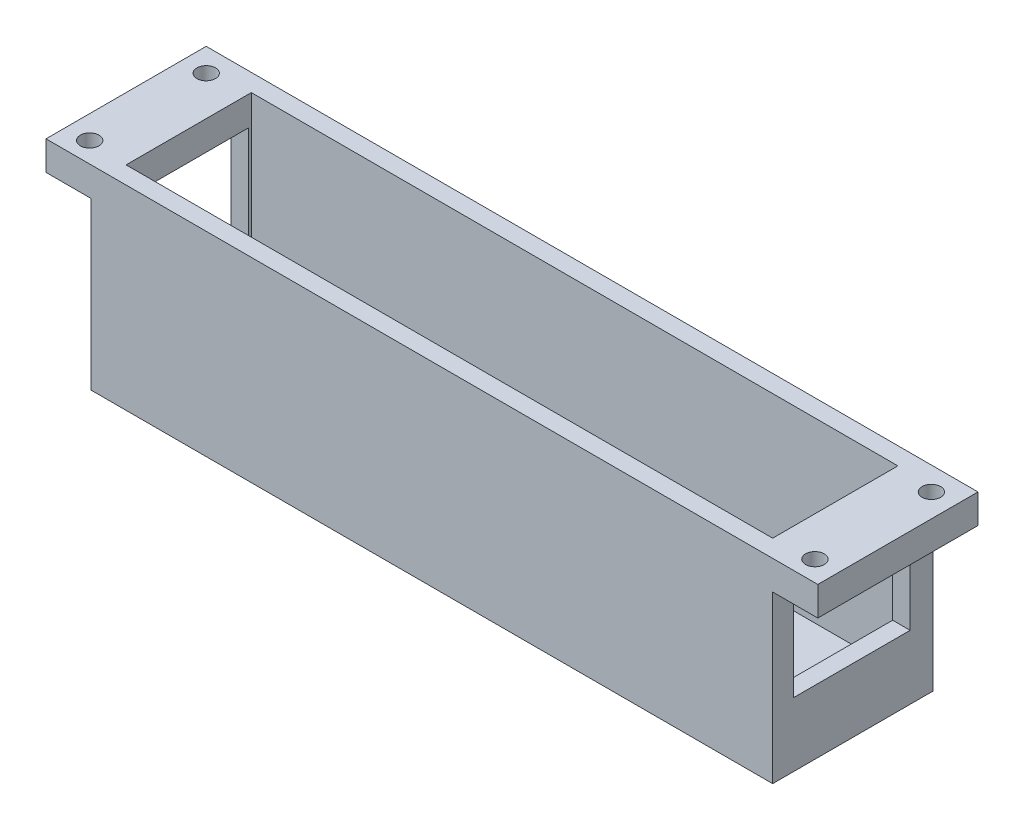
ISO-10303-21;
HEADER;
FILE_DESCRIPTION(('STEP AP214'),'2;1');
FILE_NAME('part.step','',(''),(''),'','','');
FILE_SCHEMA(('AUTOMOTIVE_DESIGN { 1 0 10303 214 1 1 1 1 }'));
ENDSEC;
DATA;
#1=APPLICATION_CONTEXT('core data for automotive mechanical design processes');
#2=APPLICATION_PROTOCOL_DEFINITION('international standard','automotive_design',2000,#1);
#3=PRODUCT_CONTEXT('',#1,'mechanical');
#4=PRODUCT('Part','Part','',(#3));
#5=PRODUCT_RELATED_PRODUCT_CATEGORY('part','',(#4));
#6=PRODUCT_DEFINITION_FORMATION('','',#4);
#7=PRODUCT_DEFINITION_CONTEXT('part definition',#1,'design');
#8=PRODUCT_DEFINITION('design','',#6,#7);
#9=PRODUCT_DEFINITION_SHAPE('','',#8);
#10=(LENGTH_UNIT() NAMED_UNIT(*) SI_UNIT(.MILLI.,.METRE.));
#11=(NAMED_UNIT(*) PLANE_ANGLE_UNIT() SI_UNIT($,.RADIAN.));
#12=(NAMED_UNIT(*) SI_UNIT($,.STERADIAN.) SOLID_ANGLE_UNIT());
#13=UNCERTAINTY_MEASURE_WITH_UNIT(LENGTH_MEASURE(1.E-05),#10,'distance_accuracy_value','');
#14=(GEOMETRIC_REPRESENTATION_CONTEXT(3) GLOBAL_UNCERTAINTY_ASSIGNED_CONTEXT((#13)) GLOBAL_UNIT_ASSIGNED_CONTEXT((#10,
#11,#12)) REPRESENTATION_CONTEXT('',''));
#15=CARTESIAN_POINT('',(0.,0.,0.));
#16=DIRECTION('',(0.,0.,1.));
#17=DIRECTION('',(1.,0.,0.));
#18=AXIS2_PLACEMENT_3D('',#15,#16,#17);
#19=CARTESIAN_POINT('',(0.,0.,27.5));
#20=DIRECTION('',(1.,0.,0.));
#21=DIRECTION('',(0.,0.,-1.));
#22=AXIS2_PLACEMENT_3D('',#19,#20,#21);
#23=PLANE('',#22);
#24=DIRECTION('',(0.,0.,1.));
#25=VECTOR('',#24,1.);
#26=CARTESIAN_POINT('',(0.,8.5,3.5));
#27=LINE('',#26,#25);
#28=CARTESIAN_POINT('',(0.,8.5,3.5));
#29=VERTEX_POINT('',#28);
#30=CARTESIAN_POINT('',(0.,8.5,24.));
#31=VERTEX_POINT('',#30);
#32=EDGE_CURVE('E206',#29,#31,#27,.T.);
#33=ORIENTED_EDGE('',*,*,#32,.F.);
#34=DIRECTION('',(0.,-1.,0.));
#35=VECTOR('',#34,1.);
#36=CARTESIAN_POINT('',(0.,28.5,3.5));
#37=LINE('',#36,#35);
#38=CARTESIAN_POINT('',(0.,28.5,3.5));
#39=VERTEX_POINT('',#38);
#40=EDGE_CURVE('E186',#39,#29,#37,.T.);
#41=ORIENTED_EDGE('',*,*,#40,.F.);
#42=DIRECTION('',(0.,0.,-1.));
#43=VECTOR('',#42,1.);
#44=CARTESIAN_POINT('',(0.,28.5,27.5));
#45=LINE('',#44,#43);
#46=CARTESIAN_POINT('',(0.,28.5,0.));
#47=VERTEX_POINT('',#46);
#48=EDGE_CURVE('E339',#39,#47,#45,.T.);
#49=ORIENTED_EDGE('',*,*,#48,.T.);
#50=DIRECTION('',(0.,-1.,0.));
#51=VECTOR('',#50,1.);
#52=CARTESIAN_POINT('',(0.,0.,0.));
#53=LINE('',#52,#51);
#54=CARTESIAN_POINT('',(0.,0.,0.));
#55=VERTEX_POINT('',#54);
#56=EDGE_CURVE('E312',#47,#55,#53,.T.);
#57=ORIENTED_EDGE('',*,*,#56,.T.);
#58=DIRECTION('',(0.,0.,-1.));
#59=VECTOR('',#58,1.);
#60=CARTESIAN_POINT('',(0.,0.,27.5));
#61=LINE('',#60,#59);
#62=CARTESIAN_POINT('',(0.,0.,27.5));
#63=VERTEX_POINT('',#62);
#64=EDGE_CURVE('E12',#63,#55,#61,.T.);
#65=ORIENTED_EDGE('',*,*,#64,.F.);
#66=DIRECTION('',(0.,-1.,0.));
#67=VECTOR('',#66,1.);
#68=CARTESIAN_POINT('',(0.,0.,27.5));
#69=LINE('',#68,#67);
#70=CARTESIAN_POINT('',(0.,28.5,27.5));
#71=VERTEX_POINT('',#70);
#72=EDGE_CURVE('E313',#71,#63,#69,.T.);
#73=ORIENTED_EDGE('',*,*,#72,.F.);
#74=CARTESIAN_POINT('',(0.,28.5,24.));
#75=VERTEX_POINT('',#74);
#76=EDGE_CURVE('E364',#71,#75,#45,.T.);
#77=ORIENTED_EDGE('',*,*,#76,.T.);
#78=DIRECTION('',(0.,1.,0.));
#79=VECTOR('',#78,1.);
#80=CARTESIAN_POINT('',(0.,28.5,24.));
#81=LINE('',#80,#79);
#82=EDGE_CURVE('E58',#31,#75,#81,.T.);
#83=ORIENTED_EDGE('',*,*,#82,.F.);
#84=EDGE_LOOP('',(#33,#41,#49,#57,#65,#73,#77,#83));
#85=FACE_BOUND('',#84,.T.);
#86=ADVANCED_FACE('F41',(#85),#23,.F.);
#87=CARTESIAN_POINT('',(0.,0.,27.5));
#88=DIRECTION('',(0.,1.,0.));
#89=DIRECTION('',(0.,0.,1.));
#90=AXIS2_PLACEMENT_3D('',#87,#88,#89);
#91=PLANE('',#90);
#92=DIRECTION('',(1.,0.,0.));
#93=VECTOR('',#92,1.);
#94=CARTESIAN_POINT('',(0.,0.,0.));
#95=LINE('',#94,#93);
#96=CARTESIAN_POINT('',(117.,0.,0.));
#97=VERTEX_POINT('',#96);
#98=EDGE_CURVE('E343',#55,#97,#95,.T.);
#99=ORIENTED_EDGE('',*,*,#98,.T.);
#100=DIRECTION('',(0.,0.,-1.));
#101=VECTOR('',#100,1.);
#102=CARTESIAN_POINT('',(117.,0.,27.5));
#103=LINE('',#102,#101);
#104=CARTESIAN_POINT('',(117.,0.,27.5));
#105=VERTEX_POINT('',#104);
#106=EDGE_CURVE('E50',#105,#97,#103,.T.);
#107=ORIENTED_EDGE('',*,*,#106,.F.);
#108=DIRECTION('',(1.,0.,0.));
#109=VECTOR('',#108,1.);
#110=CARTESIAN_POINT('',(0.,0.,27.5));
#111=LINE('',#110,#109);
#112=EDGE_CURVE('E317',#63,#105,#111,.T.);
#113=ORIENTED_EDGE('',*,*,#112,.F.);
#114=ORIENTED_EDGE('',*,*,#64,.T.);
#115=EDGE_LOOP('',(#99,#107,#113,#114));
#116=FACE_BOUND('',#115,.T.);
#117=ADVANCED_FACE('F436',(#116),#91,.F.);
#118=CARTESIAN_POINT('',(117.,0.,27.5));
#119=DIRECTION('',(-1.,0.,0.));
#120=DIRECTION('',(0.,0.,1.));
#121=AXIS2_PLACEMENT_3D('',#118,#119,#120);
#122=PLANE('',#121);
#123=DIRECTION('',(0.,0.,-1.));
#124=VECTOR('',#123,1.);
#125=CARTESIAN_POINT('',(117.,11.,23.9));
#126=LINE('',#125,#124);
#127=CARTESIAN_POINT('',(117.,11.,23.9));
#128=VERTEX_POINT('',#127);
#129=CARTESIAN_POINT('',(117.,11.,3.9));
#130=VERTEX_POINT('',#129);
#131=EDGE_CURVE('E249',#128,#130,#126,.T.);
#132=ORIENTED_EDGE('',*,*,#131,.F.);
#133=DIRECTION('',(0.,-1.,0.));
#134=VECTOR('',#133,1.);
#135=CARTESIAN_POINT('',(117.,26.,23.9));
#136=LINE('',#135,#134);
#137=CARTESIAN_POINT('',(117.,26.,23.9));
#138=VERTEX_POINT('',#137);
#139=EDGE_CURVE('E223',#138,#128,#136,.T.);
#140=ORIENTED_EDGE('',*,*,#139,.F.);
#141=DIRECTION('',(0.,0.,1.));
#142=VECTOR('',#141,1.);
#143=CARTESIAN_POINT('',(117.,26.,23.9));
#144=LINE('',#143,#142);
#145=CARTESIAN_POINT('',(117.,26.,3.9));
#146=VERTEX_POINT('',#145);
#147=EDGE_CURVE('E234',#146,#138,#144,.T.);
#148=ORIENTED_EDGE('',*,*,#147,.F.);
#149=DIRECTION('',(0.,1.,0.));
#150=VECTOR('',#149,1.);
#151=CARTESIAN_POINT('',(117.,26.,3.9));
#152=LINE('',#151,#150);
#153=EDGE_CURVE('E253',#130,#146,#152,.T.);
#154=ORIENTED_EDGE('',*,*,#153,.F.);
#155=EDGE_LOOP('',(#132,#140,#148,#154));
#156=FACE_BOUND('',#155,.T.);
#157=DIRECTION('',(0.,1.,0.));
#158=VECTOR('',#157,1.);
#159=CARTESIAN_POINT('',(117.,0.,0.));
#160=LINE('',#159,#158);
#161=CARTESIAN_POINT('',(117.,28.5,0.));
#162=VERTEX_POINT('',#161);
#163=EDGE_CURVE('E346',#97,#162,#160,.T.);
#164=ORIENTED_EDGE('',*,*,#163,.T.);
#165=DIRECTION('',(0.,0.,-1.));
#166=VECTOR('',#165,1.);
#167=CARTESIAN_POINT('',(117.,28.5,27.5));
#168=LINE('',#167,#166);
#169=CARTESIAN_POINT('',(117.,28.5,27.5));
#170=VERTEX_POINT('',#169);
#171=EDGE_CURVE('E384',#170,#162,#168,.T.);
#172=ORIENTED_EDGE('',*,*,#171,.F.);
#173=DIRECTION('',(0.,1.,0.));
#174=VECTOR('',#173,1.);
#175=CARTESIAN_POINT('',(117.,0.,27.5));
#176=LINE('',#175,#174);
#177=EDGE_CURVE('E321',#105,#170,#176,.T.);
#178=ORIENTED_EDGE('',*,*,#177,.F.);
#179=ORIENTED_EDGE('',*,*,#106,.T.);
#180=EDGE_LOOP('',(#164,#172,#178,#179));
#181=FACE_BOUND('',#180,.T.);
#182=ADVANCED_FACE('F441',(#156,#181),#122,.F.);
#183=CARTESIAN_POINT('',(124.75,28.5,27.5));
#184=DIRECTION('',(0.,1.,0.));
#185=DIRECTION('',(0.,0.,1.));
#186=AXIS2_PLACEMENT_3D('',#183,#184,#185);
#187=PLANE('',#186);
#188=CARTESIAN_POINT('',(120.75,28.5,24.));
#189=DIRECTION('',(0.,1.,0.));
#190=DIRECTION('',(0.,0.,1.));
#191=AXIS2_PLACEMENT_3D('',#188,#189,#190);
#192=CIRCLE('',#191,1.6);
#193=CARTESIAN_POINT('',(120.75,28.5,25.6));
#194=VERTEX_POINT('',#193);
#195=EDGE_CURVE('E209',#194,#194,#192,.T.);
#196=ORIENTED_EDGE('',*,*,#195,.T.);
#197=EDGE_LOOP('',(#196));
#198=FACE_BOUND('',#197,.T.);
#199=CARTESIAN_POINT('',(120.75,28.5,4.));
#200=DIRECTION('',(0.,1.,0.));
#201=DIRECTION('',(0.,0.,1.));
#202=AXIS2_PLACEMENT_3D('',#199,#200,#201);
#203=CIRCLE('',#202,1.60000000000001);
#204=CARTESIAN_POINT('',(120.75,28.5,5.6));
#205=VERTEX_POINT('',#204);
#206=EDGE_CURVE('E399',#205,#205,#203,.T.);
#207=ORIENTED_EDGE('',*,*,#206,.T.);
#208=EDGE_LOOP('',(#207));
#209=FACE_BOUND('',#208,.T.);
#210=DIRECTION('',(1.,0.,0.));
#211=VECTOR('',#210,1.);
#212=CARTESIAN_POINT('',(124.75,28.5,0.));
#213=LINE('',#212,#211);
#214=CARTESIAN_POINT('',(124.75,28.5,0.));
#215=VERTEX_POINT('',#214);
#216=EDGE_CURVE('E349',#162,#215,#213,.T.);
#217=ORIENTED_EDGE('',*,*,#216,.T.);
#218=DIRECTION('',(0.,0.,-1.));
#219=VECTOR('',#218,1.);
#220=CARTESIAN_POINT('',(124.75,28.5,27.5));
#221=LINE('',#220,#219);
#222=CARTESIAN_POINT('',(124.75,28.5,27.5));
#223=VERTEX_POINT('',#222);
#224=EDGE_CURVE('E380',#223,#215,#221,.T.);
#225=ORIENTED_EDGE('',*,*,#224,.F.);
#226=DIRECTION('',(1.,0.,0.));
#227=VECTOR('',#226,1.);
#228=CARTESIAN_POINT('',(124.75,28.5,27.5));
#229=LINE('',#228,#227);
#230=EDGE_CURVE('E324',#170,#223,#229,.T.);
#231=ORIENTED_EDGE('',*,*,#230,.F.);
#232=ORIENTED_EDGE('',*,*,#171,.T.);
#233=EDGE_LOOP('',(#217,#225,#231,#232));
#234=FACE_BOUND('',#233,.T.);
#235=ADVANCED_FACE('F420',(#198,#209,#234),#187,.F.);
#236=CARTESIAN_POINT('',(124.75,33.5,27.5));
#237=DIRECTION('',(-1.,0.,0.));
#238=DIRECTION('',(0.,0.,1.));
#239=AXIS2_PLACEMENT_3D('',#236,#237,#238);
#240=PLANE('',#239);
#241=DIRECTION('',(0.,1.,0.));
#242=VECTOR('',#241,1.);
#243=CARTESIAN_POINT('',(124.75,33.5,0.));
#244=LINE('',#243,#242);
#245=CARTESIAN_POINT('',(124.75,33.5,0.));
#246=VERTEX_POINT('',#245);
#247=EDGE_CURVE('E352',#215,#246,#244,.T.);
#248=ORIENTED_EDGE('',*,*,#247,.T.);
#249=DIRECTION('',(0.,0.,-1.));
#250=VECTOR('',#249,1.);
#251=CARTESIAN_POINT('',(124.75,33.5,27.5));
#252=LINE('',#251,#250);
#253=CARTESIAN_POINT('',(124.75,33.5,27.5));
#254=VERTEX_POINT('',#253);
#255=EDGE_CURVE('E376',#254,#246,#252,.T.);
#256=ORIENTED_EDGE('',*,*,#255,.F.);
#257=DIRECTION('',(0.,1.,0.));
#258=VECTOR('',#257,1.);
#259=CARTESIAN_POINT('',(124.75,33.5,27.5));
#260=LINE('',#259,#258);
#261=EDGE_CURVE('E327',#223,#254,#260,.T.);
#262=ORIENTED_EDGE('',*,*,#261,.F.);
#263=ORIENTED_EDGE('',*,*,#224,.T.);
#264=EDGE_LOOP('',(#248,#256,#262,#263));
#265=FACE_BOUND('',#264,.T.);
#266=ADVANCED_FACE('F514',(#265),#240,.F.);
#267=CARTESIAN_POINT('',(124.75,33.5,27.5));
#268=DIRECTION('',(0.,-1.,0.));
#269=DIRECTION('',(1.,0.,0.));
#270=AXIS2_PLACEMENT_3D('',#267,#268,#269);
#271=PLANE('',#270);
#272=CARTESIAN_POINT('',(-3.7499999999998,33.5,24.));
#273=DIRECTION('',(0.,1.,0.));
#274=DIRECTION('',(-1.,0.,0.));
#275=AXIS2_PLACEMENT_3D('',#272,#273,#274);
#276=CIRCLE('',#275,1.6);
#277=CARTESIAN_POINT('',(-5.3499999999998,33.5,24.));
#278=VERTEX_POINT('',#277);
#279=EDGE_CURVE('E410',#278,#278,#276,.T.);
#280=ORIENTED_EDGE('',*,*,#279,.F.);
#281=EDGE_LOOP('',(#280));
#282=FACE_BOUND('',#281,.T.);
#283=CARTESIAN_POINT('',(120.75,33.5,24.));
#284=DIRECTION('',(0.,1.,0.));
#285=DIRECTION('',(-1.,0.,0.));
#286=AXIS2_PLACEMENT_3D('',#283,#284,#285);
#287=CIRCLE('',#286,1.6);
#288=CARTESIAN_POINT('',(119.15,33.5,24.));
#289=VERTEX_POINT('',#288);
#290=EDGE_CURVE('E407',#289,#289,#287,.T.);
#291=ORIENTED_EDGE('',*,*,#290,.F.);
#292=EDGE_LOOP('',(#291));
#293=FACE_BOUND('',#292,.T.);
#294=CARTESIAN_POINT('',(120.75,33.5,4.));
#295=DIRECTION('',(0.,1.,0.));
#296=DIRECTION('',(-1.,0.,0.));
#297=AXIS2_PLACEMENT_3D('',#294,#295,#296);
#298=CIRCLE('',#297,1.60000000000001);
#299=CARTESIAN_POINT('',(119.15,33.5,4.));
#300=VERTEX_POINT('',#299);
#301=EDGE_CURVE('E401',#300,#300,#298,.T.);
#302=ORIENTED_EDGE('',*,*,#301,.F.);
#303=EDGE_LOOP('',(#302));
#304=FACE_BOUND('',#303,.T.);
#305=CARTESIAN_POINT('',(-3.75000000000001,33.5,4.));
#306=DIRECTION('',(0.,1.,0.));
#307=DIRECTION('',(-1.,0.,0.));
#308=AXIS2_PLACEMENT_3D('',#305,#306,#307);
#309=CIRCLE('',#308,1.6);
#310=CARTESIAN_POINT('',(-5.35000000000001,33.5,4.));
#311=VERTEX_POINT('',#310);
#312=EDGE_CURVE('E393',#311,#311,#309,.T.);
#313=ORIENTED_EDGE('',*,*,#312,.F.);
#314=EDGE_LOOP('',(#313));
#315=FACE_BOUND('',#314,.T.);
#316=DIRECTION('',(1.,0.,0.));
#317=VECTOR('',#316,1.);
#318=CARTESIAN_POINT('',(3.,33.5,24.5));
#319=LINE('',#318,#317);
#320=CARTESIAN_POINT('',(3.,33.5,24.5));
#321=VERTEX_POINT('',#320);
#322=CARTESIAN_POINT('',(114.,33.5,24.5));
#323=VERTEX_POINT('',#322);
#324=EDGE_CURVE('E286',#321,#323,#319,.T.);
#325=ORIENTED_EDGE('',*,*,#324,.F.);
#326=DIRECTION('',(0.,0.,1.));
#327=VECTOR('',#326,1.);
#328=CARTESIAN_POINT('',(3.,33.5,3.));
#329=LINE('',#328,#327);
#330=CARTESIAN_POINT('',(3.,33.5,3.));
#331=VERTEX_POINT('',#330);
#332=EDGE_CURVE('E263',#331,#321,#329,.T.);
#333=ORIENTED_EDGE('',*,*,#332,.F.);
#334=DIRECTION('',(-1.,0.,0.));
#335=VECTOR('',#334,1.);
#336=CARTESIAN_POINT('',(3.,33.5,3.));
#337=LINE('',#336,#335);
#338=CARTESIAN_POINT('',(114.,33.5,3.));
#339=VERTEX_POINT('',#338);
#340=EDGE_CURVE('E294',#339,#331,#337,.T.);
#341=ORIENTED_EDGE('',*,*,#340,.F.);
#342=DIRECTION('',(0.,0.,-1.));
#343=VECTOR('',#342,1.);
#344=CARTESIAN_POINT('',(114.,33.5,3.));
#345=LINE('',#344,#343);
#346=EDGE_CURVE('E290',#323,#339,#345,.T.);
#347=ORIENTED_EDGE('',*,*,#346,.F.);
#348=EDGE_LOOP('',(#325,#333,#341,#347));
#349=FACE_BOUND('',#348,.T.);
#350=DIRECTION('',(-1.,0.,0.));
#351=VECTOR('',#350,1.);
#352=CARTESIAN_POINT('',(124.75,33.5,0.));
#353=LINE('',#352,#351);
#354=CARTESIAN_POINT('',(-7.75000000000001,33.5,0.));
#355=VERTEX_POINT('',#354);
#356=EDGE_CURVE('E355',#246,#355,#353,.T.);
#357=ORIENTED_EDGE('',*,*,#356,.T.);
#358=DIRECTION('',(0.,0.,-1.));
#359=VECTOR('',#358,1.);
#360=CARTESIAN_POINT('',(-7.75000000000001,33.5,27.5));
#361=LINE('',#360,#359);
#362=CARTESIAN_POINT('',(-7.75000000000001,33.5,27.5));
#363=VERTEX_POINT('',#362);
#364=EDGE_CURVE('E372',#363,#355,#361,.T.);
#365=ORIENTED_EDGE('',*,*,#364,.F.);
#366=DIRECTION('',(-1.,0.,0.));
#367=VECTOR('',#366,1.);
#368=CARTESIAN_POINT('',(124.75,33.5,27.5));
#369=LINE('',#368,#367);
#370=EDGE_CURVE('E330',#254,#363,#369,.T.);
#371=ORIENTED_EDGE('',*,*,#370,.F.);
#372=ORIENTED_EDGE('',*,*,#255,.T.);
#373=EDGE_LOOP('',(#357,#365,#371,#372));
#374=FACE_BOUND('',#373,.T.);
#375=ADVANCED_FACE('F510',(#282,#293,#304,#315,#349,#374),#271,.F.);
#376=CARTESIAN_POINT('',(-7.75000000000001,33.5,27.5));
#377=DIRECTION('',(1.,0.,0.));
#378=DIRECTION('',(0.,0.,-1.));
#379=AXIS2_PLACEMENT_3D('',#376,#377,#378);
#380=PLANE('',#379);
#381=DIRECTION('',(0.,-1.,0.));
#382=VECTOR('',#381,1.);
#383=CARTESIAN_POINT('',(-7.75000000000001,33.5,0.));
#384=LINE('',#383,#382);
#385=CARTESIAN_POINT('',(-7.75000000000001,28.5,0.));
#386=VERTEX_POINT('',#385);
#387=EDGE_CURVE('E358',#355,#386,#384,.T.);
#388=ORIENTED_EDGE('',*,*,#387,.T.);
#389=DIRECTION('',(0.,0.,-1.));
#390=VECTOR('',#389,1.);
#391=CARTESIAN_POINT('',(-7.75000000000001,28.5,27.5));
#392=LINE('',#391,#390);
#393=CARTESIAN_POINT('',(-7.75000000000001,28.5,27.5));
#394=VERTEX_POINT('',#393);
#395=EDGE_CURVE('E368',#394,#386,#392,.T.);
#396=ORIENTED_EDGE('',*,*,#395,.F.);
#397=DIRECTION('',(0.,-1.,0.));
#398=VECTOR('',#397,1.);
#399=CARTESIAN_POINT('',(-7.75000000000001,33.5,27.5));
#400=LINE('',#399,#398);
#401=EDGE_CURVE('E333',#363,#394,#400,.T.);
#402=ORIENTED_EDGE('',*,*,#401,.F.);
#403=ORIENTED_EDGE('',*,*,#364,.T.);
#404=EDGE_LOOP('',(#388,#396,#402,#403));
#405=FACE_BOUND('',#404,.T.);
#406=ADVANCED_FACE('F506',(#405),#380,.F.);
#407=CARTESIAN_POINT('',(-7.75000000000001,28.5,27.5));
#408=DIRECTION('',(0.,1.,0.));
#409=DIRECTION('',(0.,0.,1.));
#410=AXIS2_PLACEMENT_3D('',#407,#408,#409);
#411=PLANE('',#410);
#412=CARTESIAN_POINT('',(-3.7499999999998,28.5,24.));
#413=DIRECTION('',(0.,1.,0.));
#414=DIRECTION('',(0.,0.,1.));
#415=AXIS2_PLACEMENT_3D('',#412,#413,#414);
#416=CIRCLE('',#415,1.6);
#417=CARTESIAN_POINT('',(-3.7499999999998,28.5,25.6));
#418=VERTEX_POINT('',#417);
#419=EDGE_CURVE('E44',#418,#418,#416,.T.);
#420=ORIENTED_EDGE('',*,*,#419,.T.);
#421=EDGE_LOOP('',(#420));
#422=FACE_BOUND('',#421,.T.);
#423=CARTESIAN_POINT('',(-3.75000000000001,28.5,4.));
#424=DIRECTION('',(0.,1.,0.));
#425=DIRECTION('',(0.,0.,1.));
#426=AXIS2_PLACEMENT_3D('',#423,#424,#425);
#427=CIRCLE('',#426,1.6);
#428=CARTESIAN_POINT('',(-3.75000000000001,28.5,5.6));
#429=VERTEX_POINT('',#428);
#430=EDGE_CURVE('E390',#429,#429,#427,.T.);
#431=ORIENTED_EDGE('',*,*,#430,.T.);
#432=EDGE_LOOP('',(#431));
#433=FACE_BOUND('',#432,.T.);
#434=DIRECTION('',(1.,0.,0.));
#435=VECTOR('',#434,1.);
#436=CARTESIAN_POINT('',(-7.75000000000001,28.5,0.));
#437=LINE('',#436,#435);
#438=EDGE_CURVE('E318',#386,#47,#437,.T.);
#439=ORIENTED_EDGE('',*,*,#438,.T.);
#440=ORIENTED_EDGE('',*,*,#48,.F.);
#441=DIRECTION('',(-1.,0.,0.));
#442=VECTOR('',#441,1.);
#443=CARTESIAN_POINT('',(3.,28.5,3.5));
#444=LINE('',#443,#442);
#445=CARTESIAN_POINT('',(3.,28.5,3.5));
#446=VERTEX_POINT('',#445);
#447=EDGE_CURVE('E220',#446,#39,#444,.T.);
#448=ORIENTED_EDGE('',*,*,#447,.F.);
#449=DIRECTION('',(0.,0.,-1.));
#450=VECTOR('',#449,1.);
#451=CARTESIAN_POINT('',(3.,28.5,3.5));
#452=LINE('',#451,#450);
#453=CARTESIAN_POINT('',(3.,28.5,24.));
#454=VERTEX_POINT('',#453);
#455=EDGE_CURVE('E192',#454,#446,#452,.T.);
#456=ORIENTED_EDGE('',*,*,#455,.F.);
#457=DIRECTION('',(-1.,0.,0.));
#458=VECTOR('',#457,1.);
#459=CARTESIAN_POINT('',(3.,28.5,24.));
#460=LINE('',#459,#458);
#461=EDGE_CURVE('E224',#454,#75,#460,.T.);
#462=ORIENTED_EDGE('',*,*,#461,.T.);
#463=ORIENTED_EDGE('',*,*,#76,.F.);
#464=DIRECTION('',(1.,0.,0.));
#465=VECTOR('',#464,1.);
#466=CARTESIAN_POINT('',(-7.75000000000001,28.5,27.5));
#467=LINE('',#466,#465);
#468=EDGE_CURVE('E336',#394,#71,#467,.T.);
#469=ORIENTED_EDGE('',*,*,#468,.F.);
#470=ORIENTED_EDGE('',*,*,#395,.T.);
#471=EDGE_LOOP('',(#439,#440,#448,#456,#462,#463,#469,#470));
#472=FACE_BOUND('',#471,.T.);
#473=ADVANCED_FACE('F449',(#422,#433,#472),#411,.F.);
#474=CARTESIAN_POINT('',(0.,0.,27.5));
#475=DIRECTION('',(0.,0.,-1.));
#476=DIRECTION('',(-1.,0.,0.));
#477=AXIS2_PLACEMENT_3D('',#474,#475,#476);
#478=PLANE('',#477);
#479=ORIENTED_EDGE('',*,*,#72,.T.);
#480=ORIENTED_EDGE('',*,*,#112,.T.);
#481=ORIENTED_EDGE('',*,*,#177,.T.);
#482=ORIENTED_EDGE('',*,*,#230,.T.);
#483=ORIENTED_EDGE('',*,*,#261,.T.);
#484=ORIENTED_EDGE('',*,*,#370,.T.);
#485=ORIENTED_EDGE('',*,*,#401,.T.);
#486=ORIENTED_EDGE('',*,*,#468,.T.);
#487=EDGE_LOOP('',(#479,#480,#481,#482,#483,#484,#485,#486));
#488=FACE_BOUND('',#487,.T.);
#489=ADVANCED_FACE('F497',(#488),#478,.F.);
#490=CARTESIAN_POINT('',(0.,0.,0.));
#491=DIRECTION('',(0.,0.,-1.));
#492=DIRECTION('',(-1.,0.,0.));
#493=AXIS2_PLACEMENT_3D('',#490,#491,#492);
#494=PLANE('',#493);
#495=ORIENTED_EDGE('',*,*,#56,.F.);
#496=ORIENTED_EDGE('',*,*,#438,.F.);
#497=ORIENTED_EDGE('',*,*,#387,.F.);
#498=ORIENTED_EDGE('',*,*,#356,.F.);
#499=ORIENTED_EDGE('',*,*,#247,.F.);
#500=ORIENTED_EDGE('',*,*,#216,.F.);
#501=ORIENTED_EDGE('',*,*,#163,.F.);
#502=ORIENTED_EDGE('',*,*,#98,.F.);
#503=EDGE_LOOP('',(#495,#496,#497,#498,#499,#500,#501,#502));
#504=FACE_BOUND('',#503,.T.);
#505=ADVANCED_FACE('F496',(#504),#494,.T.);
#506=CARTESIAN_POINT('',(3.00000000000001,-113.063035515592,3.));
#507=DIRECTION('',(-1.,0.,0.));
#508=DIRECTION('',(0.,0.,1.));
#509=AXIS2_PLACEMENT_3D('',#506,#507,#508);
#510=PLANE('',#509);
#511=ORIENTED_EDGE('',*,*,#455,.T.);
#512=DIRECTION('',(0.,-1.,0.));
#513=VECTOR('',#512,1.);
#514=CARTESIAN_POINT('',(3.,28.5,3.5));
#515=LINE('',#514,#513);
#516=CARTESIAN_POINT('',(3.,8.5,3.5));
#517=VERTEX_POINT('',#516);
#518=EDGE_CURVE('E183',#446,#517,#515,.T.);
#519=ORIENTED_EDGE('',*,*,#518,.T.);
#520=DIRECTION('',(0.,0.,1.));
#521=VECTOR('',#520,1.);
#522=CARTESIAN_POINT('',(3.,8.5,3.5));
#523=LINE('',#522,#521);
#524=CARTESIAN_POINT('',(3.,8.50000000000001,24.));
#525=VERTEX_POINT('',#524);
#526=EDGE_CURVE('E195',#517,#525,#523,.T.);
#527=ORIENTED_EDGE('',*,*,#526,.T.);
#528=DIRECTION('',(0.,1.,0.));
#529=VECTOR('',#528,1.);
#530=CARTESIAN_POINT('',(3.,28.5,24.));
#531=LINE('',#530,#529);
#532=EDGE_CURVE('E63',#525,#454,#531,.T.);
#533=ORIENTED_EDGE('',*,*,#532,.T.);
#534=EDGE_LOOP('',(#511,#519,#527,#533));
#535=FACE_BOUND('',#534,.T.);
#536=DIRECTION('',(0.,0.,-1.));
#537=VECTOR('',#536,1.);
#538=CARTESIAN_POINT('',(3.,3.,3.));
#539=LINE('',#538,#537);
#540=CARTESIAN_POINT('',(3.,3.,24.5));
#541=VERTEX_POINT('',#540);
#542=CARTESIAN_POINT('',(3.,3.,3.));
#543=VERTEX_POINT('',#542);
#544=EDGE_CURVE('E280',#541,#543,#539,.T.);
#545=ORIENTED_EDGE('',*,*,#544,.T.);
#546=DIRECTION('',(0.,1.,0.));
#547=VECTOR('',#546,1.);
#548=CARTESIAN_POINT('',(3.00000000000001,-113.063035515592,3.));
#549=LINE('',#548,#547);
#550=EDGE_CURVE('E277',#543,#331,#549,.T.);
#551=ORIENTED_EDGE('',*,*,#550,.T.);
#552=ORIENTED_EDGE('',*,*,#332,.T.);
#553=DIRECTION('',(0.,1.,0.));
#554=VECTOR('',#553,1.);
#555=CARTESIAN_POINT('',(3.00000000000002,-113.063035515592,24.5));
#556=LINE('',#555,#554);
#557=EDGE_CURVE('E298',#541,#321,#556,.T.);
#558=ORIENTED_EDGE('',*,*,#557,.F.);
#559=EDGE_LOOP('',(#545,#551,#552,#558));
#560=FACE_BOUND('',#559,.T.);
#561=ADVANCED_FACE('F200',(#535,#560),#510,.F.);
#562=CARTESIAN_POINT('',(3.00000000000001,-113.063035515592,3.));
#563=DIRECTION('',(0.,0.,-1.));
#564=DIRECTION('',(-1.,0.,0.));
#565=AXIS2_PLACEMENT_3D('',#562,#563,#564);
#566=PLANE('',#565);
#567=DIRECTION('',(1.,0.,0.));
#568=VECTOR('',#567,1.);
#569=CARTESIAN_POINT('',(3.00000000000001,3.,3.));
#570=LINE('',#569,#568);
#571=CARTESIAN_POINT('',(114.,3.,3.));
#572=VERTEX_POINT('',#571);
#573=EDGE_CURVE('E276',#543,#572,#570,.T.);
#574=ORIENTED_EDGE('',*,*,#573,.T.);
#575=DIRECTION('',(0.,1.,0.));
#576=VECTOR('',#575,1.);
#577=CARTESIAN_POINT('',(114.,-113.063035515592,3.));
#578=LINE('',#577,#576);
#579=EDGE_CURVE('E301',#572,#339,#578,.T.);
#580=ORIENTED_EDGE('',*,*,#579,.T.);
#581=ORIENTED_EDGE('',*,*,#340,.T.);
#582=ORIENTED_EDGE('',*,*,#550,.F.);
#583=EDGE_LOOP('',(#574,#580,#581,#582));
#584=FACE_BOUND('',#583,.T.);
#585=ADVANCED_FACE('F483',(#584),#566,.F.);
#586=CARTESIAN_POINT('',(114.,-113.063035515592,3.));
#587=DIRECTION('',(1.,0.,0.));
#588=DIRECTION('',(0.,1.,0.));
#589=AXIS2_PLACEMENT_3D('',#586,#587,#588);
#590=PLANE('',#589);
#591=DIRECTION('',(0.,0.,1.));
#592=VECTOR('',#591,1.);
#593=CARTESIAN_POINT('',(114.,26.,23.9));
#594=LINE('',#593,#592);
#595=CARTESIAN_POINT('',(114.,26.,3.9));
#596=VERTEX_POINT('',#595);
#597=CARTESIAN_POINT('',(114.,26.,23.9));
#598=VERTEX_POINT('',#597);
#599=EDGE_CURVE('E242',#596,#598,#594,.T.);
#600=ORIENTED_EDGE('',*,*,#599,.T.);
#601=DIRECTION('',(0.,-1.,0.));
#602=VECTOR('',#601,1.);
#603=CARTESIAN_POINT('',(114.,26.,23.9));
#604=LINE('',#603,#602);
#605=CARTESIAN_POINT('',(114.,11.,23.9));
#606=VERTEX_POINT('',#605);
#607=EDGE_CURVE('E229',#598,#606,#604,.T.);
#608=ORIENTED_EDGE('',*,*,#607,.T.);
#609=DIRECTION('',(0.,0.,-1.));
#610=VECTOR('',#609,1.);
#611=CARTESIAN_POINT('',(114.,11.,23.9));
#612=LINE('',#611,#610);
#613=CARTESIAN_POINT('',(114.,11.,3.9));
#614=VERTEX_POINT('',#613);
#615=EDGE_CURVE('E233',#606,#614,#612,.T.);
#616=ORIENTED_EDGE('',*,*,#615,.T.);
#617=DIRECTION('',(0.,1.,0.));
#618=VECTOR('',#617,1.);
#619=CARTESIAN_POINT('',(114.,26.,3.9));
#620=LINE('',#619,#618);
#621=EDGE_CURVE('E238',#614,#596,#620,.T.);
#622=ORIENTED_EDGE('',*,*,#621,.T.);
#623=EDGE_LOOP('',(#600,#608,#616,#622));
#624=FACE_BOUND('',#623,.T.);
#625=DIRECTION('',(0.,0.,1.));
#626=VECTOR('',#625,1.);
#627=CARTESIAN_POINT('',(114.,3.,3.));
#628=LINE('',#627,#626);
#629=CARTESIAN_POINT('',(114.,3.,24.5));
#630=VERTEX_POINT('',#629);
#631=EDGE_CURVE('E273',#572,#630,#628,.T.);
#632=ORIENTED_EDGE('',*,*,#631,.T.);
#633=DIRECTION('',(0.,1.,0.));
#634=VECTOR('',#633,1.);
#635=CARTESIAN_POINT('',(114.,-113.063035515592,24.5));
#636=LINE('',#635,#634);
#637=EDGE_CURVE('E304',#630,#323,#636,.T.);
#638=ORIENTED_EDGE('',*,*,#637,.T.);
#639=ORIENTED_EDGE('',*,*,#346,.T.);
#640=ORIENTED_EDGE('',*,*,#579,.F.);
#641=EDGE_LOOP('',(#632,#638,#639,#640));
#642=FACE_BOUND('',#641,.T.);
#643=ADVANCED_FACE('F486',(#624,#642),#590,.F.);
#644=CARTESIAN_POINT('',(3.00000000000002,-113.063035515592,24.5));
#645=DIRECTION('',(0.,0.,1.));
#646=DIRECTION('',(1.,0.,0.));
#647=AXIS2_PLACEMENT_3D('',#644,#645,#646);
#648=PLANE('',#647);
#649=DIRECTION('',(-1.,0.,0.));
#650=VECTOR('',#649,1.);
#651=CARTESIAN_POINT('',(3.00000000000002,3.,24.5));
#652=LINE('',#651,#650);
#653=EDGE_CURVE('E283',#630,#541,#652,.T.);
#654=ORIENTED_EDGE('',*,*,#653,.T.);
#655=ORIENTED_EDGE('',*,*,#557,.T.);
#656=ORIENTED_EDGE('',*,*,#324,.T.);
#657=ORIENTED_EDGE('',*,*,#637,.F.);
#658=EDGE_LOOP('',(#654,#655,#656,#657));
#659=FACE_BOUND('',#658,.T.);
#660=ADVANCED_FACE('F481',(#659),#648,.F.);
#661=CARTESIAN_POINT('',(0.,3.,27.5));
#662=DIRECTION('',(0.,1.,0.));
#663=DIRECTION('',(0.,0.,1.));
#664=AXIS2_PLACEMENT_3D('',#661,#662,#663);
#665=PLANE('',#664);
#666=ORIENTED_EDGE('',*,*,#544,.F.);
#667=ORIENTED_EDGE('',*,*,#653,.F.);
#668=ORIENTED_EDGE('',*,*,#631,.F.);
#669=ORIENTED_EDGE('',*,*,#573,.F.);
#670=EDGE_LOOP('',(#666,#667,#668,#669));
#671=FACE_BOUND('',#670,.T.);
#672=ADVANCED_FACE('F477',(#671),#665,.T.);
#673=CARTESIAN_POINT('',(114.,26.,23.9));
#674=DIRECTION('',(0.,0.,1.));
#675=DIRECTION('',(1.,0.,0.));
#676=AXIS2_PLACEMENT_3D('',#673,#674,#675);
#677=PLANE('',#676);
#678=ORIENTED_EDGE('',*,*,#139,.T.);
#679=DIRECTION('',(1.,0.,0.));
#680=VECTOR('',#679,1.);
#681=CARTESIAN_POINT('',(114.,11.,23.9));
#682=LINE('',#681,#680);
#683=EDGE_CURVE('E246',#606,#128,#682,.T.);
#684=ORIENTED_EDGE('',*,*,#683,.F.);
#685=ORIENTED_EDGE('',*,*,#607,.F.);
#686=DIRECTION('',(1.,0.,0.));
#687=VECTOR('',#686,1.);
#688=CARTESIAN_POINT('',(114.,26.,23.9));
#689=LINE('',#688,#687);
#690=EDGE_CURVE('E260',#598,#138,#689,.T.);
#691=ORIENTED_EDGE('',*,*,#690,.T.);
#692=EDGE_LOOP('',(#678,#684,#685,#691));
#693=FACE_BOUND('',#692,.T.);
#694=ADVANCED_FACE('F467',(#693),#677,.F.);
#695=CARTESIAN_POINT('',(114.,26.,23.9));
#696=DIRECTION('',(0.,1.,0.));
#697=DIRECTION('',(0.,0.,1.));
#698=AXIS2_PLACEMENT_3D('',#695,#696,#697);
#699=PLANE('',#698);
#700=ORIENTED_EDGE('',*,*,#147,.T.);
#701=ORIENTED_EDGE('',*,*,#690,.F.);
#702=ORIENTED_EDGE('',*,*,#599,.F.);
#703=DIRECTION('',(1.,0.,0.));
#704=VECTOR('',#703,1.);
#705=CARTESIAN_POINT('',(114.,26.,3.9));
#706=LINE('',#705,#704);
#707=EDGE_CURVE('E264',#596,#146,#706,.T.);
#708=ORIENTED_EDGE('',*,*,#707,.T.);
#709=EDGE_LOOP('',(#700,#701,#702,#708));
#710=FACE_BOUND('',#709,.T.);
#711=ADVANCED_FACE('F463',(#710),#699,.F.);
#712=CARTESIAN_POINT('',(114.,26.,3.9));
#713=DIRECTION('',(0.,0.,-1.));
#714=DIRECTION('',(0.,1.,0.));
#715=AXIS2_PLACEMENT_3D('',#712,#713,#714);
#716=PLANE('',#715);
#717=ORIENTED_EDGE('',*,*,#153,.T.);
#718=ORIENTED_EDGE('',*,*,#707,.F.);
#719=ORIENTED_EDGE('',*,*,#621,.F.);
#720=DIRECTION('',(1.,0.,0.));
#721=VECTOR('',#720,1.);
#722=CARTESIAN_POINT('',(114.,11.,3.9));
#723=LINE('',#722,#721);
#724=EDGE_CURVE('E267',#614,#130,#723,.T.);
#725=ORIENTED_EDGE('',*,*,#724,.T.);
#726=EDGE_LOOP('',(#717,#718,#719,#725));
#727=FACE_BOUND('',#726,.T.);
#728=ADVANCED_FACE('F466',(#727),#716,.F.);
#729=CARTESIAN_POINT('',(114.,11.,23.9));
#730=DIRECTION('',(0.,-1.,0.));
#731=DIRECTION('',(0.,0.,-1.));
#732=AXIS2_PLACEMENT_3D('',#729,#730,#731);
#733=PLANE('',#732);
#734=ORIENTED_EDGE('',*,*,#131,.T.);
#735=ORIENTED_EDGE('',*,*,#724,.F.);
#736=ORIENTED_EDGE('',*,*,#615,.F.);
#737=ORIENTED_EDGE('',*,*,#683,.T.);
#738=EDGE_LOOP('',(#734,#735,#736,#737));
#739=FACE_BOUND('',#738,.T.);
#740=ADVANCED_FACE('F459',(#739),#733,.F.);
#741=CARTESIAN_POINT('',(3.,28.5,3.5));
#742=DIRECTION('',(0.,0.,-1.));
#743=DIRECTION('',(0.,1.,0.));
#744=AXIS2_PLACEMENT_3D('',#741,#742,#743);
#745=PLANE('',#744);
#746=ORIENTED_EDGE('',*,*,#40,.T.);
#747=DIRECTION('',(-1.,0.,0.));
#748=VECTOR('',#747,1.);
#749=CARTESIAN_POINT('',(3.,8.5,3.5));
#750=LINE('',#749,#748);
#751=EDGE_CURVE('E179',#517,#29,#750,.T.);
#752=ORIENTED_EDGE('',*,*,#751,.F.);
#753=ORIENTED_EDGE('',*,*,#518,.F.);
#754=ORIENTED_EDGE('',*,*,#447,.T.);
#755=EDGE_LOOP('',(#746,#752,#753,#754));
#756=FACE_BOUND('',#755,.T.);
#757=ADVANCED_FACE('F181',(#756),#745,.F.);
#758=CARTESIAN_POINT('',(3.,28.5,24.));
#759=DIRECTION('',(0.,0.,1.));
#760=DIRECTION('',(0.,-1.,0.));
#761=AXIS2_PLACEMENT_3D('',#758,#759,#760);
#762=PLANE('',#761);
#763=ORIENTED_EDGE('',*,*,#82,.T.);
#764=ORIENTED_EDGE('',*,*,#461,.F.);
#765=ORIENTED_EDGE('',*,*,#532,.F.);
#766=DIRECTION('',(-1.,0.,0.));
#767=VECTOR('',#766,1.);
#768=CARTESIAN_POINT('',(3.,8.5,24.));
#769=LINE('',#768,#767);
#770=EDGE_CURVE('E191',#525,#31,#769,.T.);
#771=ORIENTED_EDGE('',*,*,#770,.T.);
#772=EDGE_LOOP('',(#763,#764,#765,#771));
#773=FACE_BOUND('',#772,.T.);
#774=ADVANCED_FACE('F450',(#773),#762,.F.);
#775=CARTESIAN_POINT('',(3.,8.5,3.5));
#776=DIRECTION('',(0.,-1.,0.));
#777=DIRECTION('',(0.,0.,-1.));
#778=AXIS2_PLACEMENT_3D('',#775,#776,#777);
#779=PLANE('',#778);
#780=ORIENTED_EDGE('',*,*,#32,.T.);
#781=ORIENTED_EDGE('',*,*,#770,.F.);
#782=ORIENTED_EDGE('',*,*,#526,.F.);
#783=ORIENTED_EDGE('',*,*,#751,.T.);
#784=EDGE_LOOP('',(#780,#781,#782,#783));
#785=FACE_BOUND('',#784,.T.);
#786=ADVANCED_FACE('F196',(#785),#779,.F.);
#787=CARTESIAN_POINT('',(-3.75,0.,4.));
#788=DIRECTION('',(0.,1.,0.));
#789=DIRECTION('',(-1.,0.,0.));
#790=AXIS2_PLACEMENT_3D('',#787,#788,#789);
#791=CYLINDRICAL_SURFACE('',#790,1.6);
#792=ORIENTED_EDGE('',*,*,#312,.T.);
#793=EDGE_LOOP('',(#792));
#794=FACE_BOUND('',#793,.T.);
#795=ORIENTED_EDGE('',*,*,#430,.F.);
#796=EDGE_LOOP('',(#795));
#797=FACE_BOUND('',#796,.T.);
#798=ADVANCED_FACE('F457',(#794,#797),#791,.F.);
#799=CARTESIAN_POINT('',(-3.7499999999998,0.,24.));
#800=DIRECTION('',(0.,1.,0.));
#801=DIRECTION('',(-1.,0.,0.));
#802=AXIS2_PLACEMENT_3D('',#799,#800,#801);
#803=CYLINDRICAL_SURFACE('',#802,1.6);
#804=ORIENTED_EDGE('',*,*,#279,.T.);
#805=EDGE_LOOP('',(#804));
#806=FACE_BOUND('',#805,.T.);
#807=ORIENTED_EDGE('',*,*,#419,.F.);
#808=EDGE_LOOP('',(#807));
#809=FACE_BOUND('',#808,.T.);
#810=ADVANCED_FACE('F430',(#806,#809),#803,.F.);
#811=CARTESIAN_POINT('',(120.75,0.,4.));
#812=DIRECTION('',(0.,1.,0.));
#813=DIRECTION('',(-1.,0.,0.));
#814=AXIS2_PLACEMENT_3D('',#811,#812,#813);
#815=CYLINDRICAL_SURFACE('',#814,1.60000000000001);
#816=ORIENTED_EDGE('',*,*,#301,.T.);
#817=EDGE_LOOP('',(#816));
#818=FACE_BOUND('',#817,.T.);
#819=ORIENTED_EDGE('',*,*,#206,.F.);
#820=EDGE_LOOP('',(#819));
#821=FACE_BOUND('',#820,.T.);
#822=ADVANCED_FACE('F424',(#818,#821),#815,.F.);
#823=CARTESIAN_POINT('',(120.75,0.,24.));
#824=DIRECTION('',(0.,1.,0.));
#825=DIRECTION('',(-1.,0.,0.));
#826=AXIS2_PLACEMENT_3D('',#823,#824,#825);
#827=CYLINDRICAL_SURFACE('',#826,1.6);
#828=ORIENTED_EDGE('',*,*,#290,.T.);
#829=EDGE_LOOP('',(#828));
#830=FACE_BOUND('',#829,.T.);
#831=ORIENTED_EDGE('',*,*,#195,.F.);
#832=EDGE_LOOP('',(#831));
#833=FACE_BOUND('',#832,.T.);
#834=ADVANCED_FACE('F422',(#830,#833),#827,.F.);
#835=CLOSED_SHELL('',(#86,#117,#182,#235,#266,#375,#406,#473,#489,#505,#561,#585,#643,#660,#672,
#694,#711,#728,#740,#757,#774,#786,#798,#810,#822,#834));
#836=MANIFOLD_SOLID_BREP('B2',#835);
#837=ADVANCED_BREP_SHAPE_REPRESENTATION('',(#18,#836),#14);
#838=SHAPE_DEFINITION_REPRESENTATION(#9,#837);
ENDSEC;
END-ISO-10303-21;
